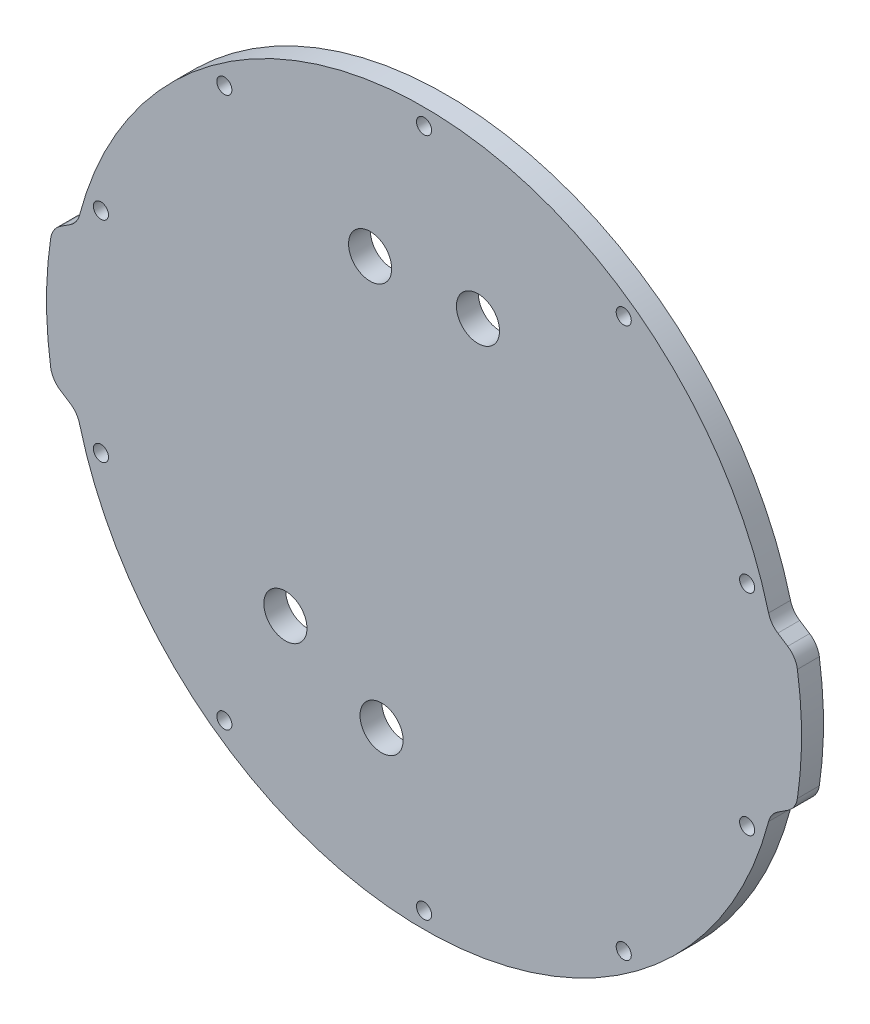
ISO-10303-21;
HEADER;
FILE_DESCRIPTION(('STEP AP214'),'2;1');
FILE_NAME('part.step','',(''),(''),'','','');
FILE_SCHEMA(('AUTOMOTIVE_DESIGN { 1 0 10303 214 1 1 1 1 }'));
ENDSEC;
DATA;
#1=APPLICATION_CONTEXT('core data for automotive mechanical design processes');
#2=APPLICATION_PROTOCOL_DEFINITION('international standard','automotive_design',2000,#1);
#3=PRODUCT_CONTEXT('',#1,'mechanical');
#4=PRODUCT('Part','Part','',(#3));
#5=PRODUCT_RELATED_PRODUCT_CATEGORY('part','',(#4));
#6=PRODUCT_DEFINITION_FORMATION('','',#4);
#7=PRODUCT_DEFINITION_CONTEXT('part definition',#1,'design');
#8=PRODUCT_DEFINITION('design','',#6,#7);
#9=PRODUCT_DEFINITION_SHAPE('','',#8);
#10=(LENGTH_UNIT() NAMED_UNIT(*) SI_UNIT(.MILLI.,.METRE.));
#11=(NAMED_UNIT(*) PLANE_ANGLE_UNIT() SI_UNIT($,.RADIAN.));
#12=(NAMED_UNIT(*) SI_UNIT($,.STERADIAN.) SOLID_ANGLE_UNIT());
#13=UNCERTAINTY_MEASURE_WITH_UNIT(LENGTH_MEASURE(1.E-05),#10,'distance_accuracy_value','');
#14=(GEOMETRIC_REPRESENTATION_CONTEXT(3) GLOBAL_UNCERTAINTY_ASSIGNED_CONTEXT((#13)) GLOBAL_UNIT_ASSIGNED_CONTEXT((#10,
#11,#12)) REPRESENTATION_CONTEXT('',''));
#15=CARTESIAN_POINT('',(0.,0.,0.));
#16=DIRECTION('',(0.,0.,1.));
#17=DIRECTION('',(1.,0.,0.));
#18=AXIS2_PLACEMENT_3D('',#15,#16,#17);
#19=CARTESIAN_POINT('',(0.,0.,2.54));
#20=DIRECTION('',(0.,0.,1.));
#21=DIRECTION('',(1.,0.,0.));
#22=AXIS2_PLACEMENT_3D('',#19,#20,#21);
#23=PLANE('',#22);
#24=CARTESIAN_POINT('',(-12.5,46.34382375247,2.54));
#25=DIRECTION('',(0.,0.,1.));
#26=DIRECTION('',(1.,0.,0.));
#27=AXIS2_PLACEMENT_3D('',#24,#25,#26);
#28=CIRCLE('',#27,5.);
#29=CARTESIAN_POINT('',(-7.5,46.34382375247,2.54));
#30=VERTEX_POINT('',#29);
#31=EDGE_CURVE('E387',#30,#30,#28,.T.);
#32=ORIENTED_EDGE('',*,*,#31,.F.);
#33=EDGE_LOOP('',(#32));
#34=FACE_BOUND('',#33,.T.);
#35=CARTESIAN_POINT('',(-46.2822107655094,63.7019981370833,2.54));
#36=DIRECTION('',(0.,0.,1.));
#37=DIRECTION('',(1.,0.,0.));
#38=AXIS2_PLACEMENT_3D('',#35,#36,#37);
#39=CIRCLE('',#38,1.75000000000102);
#40=CARTESIAN_POINT('',(-44.5322107655083,63.7019981370833,2.54));
#41=VERTEX_POINT('',#40);
#42=EDGE_CURVE('E407',#41,#41,#39,.T.);
#43=ORIENTED_EDGE('',*,*,#42,.F.);
#44=EDGE_LOOP('',(#43));
#45=FACE_BOUND('',#44,.T.);
#46=CARTESIAN_POINT('',(-74.8861900930804,-24.3319981370834,2.54));
#47=DIRECTION('',(0.,0.,1.));
#48=DIRECTION('',(1.,0.,0.));
#49=AXIS2_PLACEMENT_3D('',#46,#47,#48);
#50=CIRCLE('',#49,1.75000000000072);
#51=CARTESIAN_POINT('',(-73.1361900930797,-24.3319981370834,2.54));
#52=VERTEX_POINT('',#51);
#53=EDGE_CURVE('E443',#52,#52,#50,.T.);
#54=ORIENTED_EDGE('',*,*,#53,.F.);
#55=EDGE_LOOP('',(#54));
#56=FACE_BOUND('',#55,.T.);
#57=CARTESIAN_POINT('',(0.,-78.74,2.54));
#58=DIRECTION('',(0.,0.,1.));
#59=DIRECTION('',(1.,0.,0.));
#60=AXIS2_PLACEMENT_3D('',#57,#58,#59);
#61=CIRCLE('',#60,1.75000000000052);
#62=CARTESIAN_POINT('',(1.75000000000052,-78.74,2.54));
#63=VERTEX_POINT('',#62);
#64=EDGE_CURVE('E475',#63,#63,#61,.T.);
#65=ORIENTED_EDGE('',*,*,#64,.F.);
#66=EDGE_LOOP('',(#65));
#67=FACE_BOUND('',#66,.T.);
#68=CARTESIAN_POINT('',(74.8861900930804,-24.3319981370834,2.54));
#69=DIRECTION('',(0.,0.,1.));
#70=DIRECTION('',(1.,0.,0.));
#71=AXIS2_PLACEMENT_3D('',#68,#69,#70);
#72=CIRCLE('',#71,1.75000000000031);
#73=CARTESIAN_POINT('',(76.6361900930807,-24.3319981370834,2.54));
#74=VERTEX_POINT('',#73);
#75=EDGE_CURVE('E495',#74,#74,#72,.T.);
#76=ORIENTED_EDGE('',*,*,#75,.F.);
#77=EDGE_LOOP('',(#76));
#78=FACE_BOUND('',#77,.T.);
#79=CARTESIAN_POINT('',(46.2822107655093,63.7019981370834,2.54));
#80=DIRECTION('',(0.,0.,1.));
#81=DIRECTION('',(1.,0.,0.));
#82=AXIS2_PLACEMENT_3D('',#79,#80,#81);
#83=CIRCLE('',#82,1.75000000000012);
#84=CARTESIAN_POINT('',(48.0322107655095,63.7019981370834,2.54));
#85=VERTEX_POINT('',#84);
#86=EDGE_CURVE('E687',#85,#85,#83,.T.);
#87=ORIENTED_EDGE('',*,*,#86,.F.);
#88=EDGE_LOOP('',(#87));
#89=FACE_BOUND('',#88,.T.);
#90=CARTESIAN_POINT('',(-32.1346712353663,-35.65617624753,2.54));
#91=DIRECTION('',(0.,0.,1.));
#92=DIRECTION('',(1.,0.,0.));
#93=AXIS2_PLACEMENT_3D('',#90,#91,#92);
#94=CIRCLE('',#93,5.);
#95=CARTESIAN_POINT('',(-27.1346712353663,-35.65617624753,2.54));
#96=VERTEX_POINT('',#95);
#97=EDGE_CURVE('E226',#96,#96,#94,.T.);
#98=ORIENTED_EDGE('',*,*,#97,.F.);
#99=EDGE_LOOP('',(#98));
#100=FACE_BOUND('',#99,.T.);
#101=DIRECTION('',(-0.837556685880563,-0.54635043510257,0.));
#102=VECTOR('',#101,1.);
#103=CARTESIAN_POINT('',(-86.162592811498,15.24,2.54));
#104=LINE('',#103,#102);
#105=CARTESIAN_POINT('',(-81.9918140206452,17.9606598019133,2.54));
#106=VERTEX_POINT('',#105);
#107=CARTESIAN_POINT('',(-84.2861379976626,16.4640388277856,2.54));
#108=VERTEX_POINT('',#107);
#109=EDGE_CURVE('E239',#106,#108,#104,.T.);
#110=ORIENTED_EDGE('',*,*,#109,.T.);
#111=CARTESIAN_POINT('',(-81.5106777873416,12.2092508635123,2.54));
#112=DIRECTION('',(0.,0.,1.));
#113=DIRECTION('',(1.,0.,0.));
#114=AXIS2_PLACEMENT_3D('',#111,#112,#113);
#115=CIRCLE('',#114,5.08);
#116=CARTESIAN_POINT('',(-86.5346312350448,12.9617744547116,2.54));
#117=VERTEX_POINT('',#116);
#118=EDGE_CURVE('E422',#108,#117,#115,.T.);
#119=ORIENTED_EDGE('',*,*,#118,.T.);
#120=CARTESIAN_POINT('',(0.,0.,2.54));
#121=DIRECTION('',(0.,0.,1.));
#122=DIRECTION('',(1.,0.,0.));
#123=AXIS2_PLACEMENT_3D('',#120,#121,#122);
#124=CIRCLE('',#123,87.5);
#125=CARTESIAN_POINT('',(-86.5346312350448,-12.9617744547116,2.54));
#126=VERTEX_POINT('',#125);
#127=EDGE_CURVE('E216',#117,#126,#124,.T.);
#128=ORIENTED_EDGE('',*,*,#127,.T.);
#129=CARTESIAN_POINT('',(-81.5106777873416,-12.2092508635123,2.54));
#130=DIRECTION('',(0.,0.,1.));
#131=DIRECTION('',(1.,0.,0.));
#132=AXIS2_PLACEMENT_3D('',#129,#130,#131);
#133=CIRCLE('',#132,5.08);
#134=CARTESIAN_POINT('',(-84.2861379976626,-16.4640388277856,2.54));
#135=VERTEX_POINT('',#134);
#136=EDGE_CURVE('E426',#126,#135,#133,.T.);
#137=ORIENTED_EDGE('',*,*,#136,.T.);
#138=DIRECTION('',(0.837556685880563,-0.54635043510257,0.));
#139=VECTOR('',#138,1.);
#140=CARTESIAN_POINT('',(-86.162592811498,-15.24,2.54));
#141=LINE('',#140,#139);
#142=CARTESIAN_POINT('',(-81.9918140206452,-17.9606598019133,2.54));
#143=VERTEX_POINT('',#142);
#144=EDGE_CURVE('E287',#135,#143,#141,.T.);
#145=ORIENTED_EDGE('',*,*,#144,.T.);
#146=CARTESIAN_POINT('',(-84.7672742309663,-22.2154477661866,2.54));
#147=DIRECTION('',(0.,0.,1.));
#148=DIRECTION('',(1.,0.,0.));
#149=AXIS2_PLACEMENT_3D('',#146,#147,#148);
#150=CIRCLE('',#149,5.08);
#151=CARTESIAN_POINT('',(-79.8532293480117,-20.9275957217699,2.54));
#152=VERTEX_POINT('',#151);
#153=EDGE_CURVE('E268',#143,#152,#150,.F.);
#154=ORIENTED_EDGE('',*,*,#153,.T.);
#155=CARTESIAN_POINT('',(0.,0.,2.54));
#156=DIRECTION('',(0.,0.,1.));
#157=DIRECTION('',(1.,0.,0.));
#158=AXIS2_PLACEMENT_3D('',#155,#156,#157);
#159=CIRCLE('',#158,82.55);
#160=CARTESIAN_POINT('',(79.8532293480117,-20.9275957217699,2.54));
#161=VERTEX_POINT('',#160);
#162=EDGE_CURVE('E344',#152,#161,#159,.T.);
#163=ORIENTED_EDGE('',*,*,#162,.T.);
#164=CARTESIAN_POINT('',(84.7672742309663,-22.2154477661866,2.54));
#165=DIRECTION('',(0.,0.,1.));
#166=DIRECTION('',(1.,0.,0.));
#167=AXIS2_PLACEMENT_3D('',#164,#165,#166);
#168=CIRCLE('',#167,5.08);
#169=CARTESIAN_POINT('',(81.9918140206452,-17.9606598019133,2.54));
#170=VERTEX_POINT('',#169);
#171=EDGE_CURVE('E783',#161,#170,#168,.F.);
#172=ORIENTED_EDGE('',*,*,#171,.T.);
#173=DIRECTION('',(0.837556685880563,0.54635043510257,0.));
#174=VECTOR('',#173,1.);
#175=CARTESIAN_POINT('',(86.162592811498,-15.24,2.54));
#176=LINE('',#175,#174);
#177=CARTESIAN_POINT('',(84.2861379976626,-16.4640388277856,2.54));
#178=VERTEX_POINT('',#177);
#179=EDGE_CURVE('E340',#170,#178,#176,.T.);
#180=ORIENTED_EDGE('',*,*,#179,.T.);
#181=CARTESIAN_POINT('',(81.5106777873416,-12.2092508635123,2.54));
#182=DIRECTION('',(0.,0.,1.));
#183=DIRECTION('',(1.,0.,0.));
#184=AXIS2_PLACEMENT_3D('',#181,#182,#183);
#185=CIRCLE('',#184,5.08);
#186=CARTESIAN_POINT('',(86.5346312350448,-12.9617744547116,2.54));
#187=VERTEX_POINT('',#186);
#188=EDGE_CURVE('E319',#178,#187,#185,.T.);
#189=ORIENTED_EDGE('',*,*,#188,.T.);
#190=CARTESIAN_POINT('',(0.,0.,2.54));
#191=DIRECTION('',(0.,0.,1.));
#192=DIRECTION('',(1.,0.,0.));
#193=AXIS2_PLACEMENT_3D('',#190,#191,#192);
#194=CIRCLE('',#193,87.5);
#195=CARTESIAN_POINT('',(86.5346312350448,12.9617744547116,2.54));
#196=VERTEX_POINT('',#195);
#197=EDGE_CURVE('E336',#187,#196,#194,.T.);
#198=ORIENTED_EDGE('',*,*,#197,.T.);
#199=CARTESIAN_POINT('',(81.5106777873416,12.2092508635123,2.54));
#200=DIRECTION('',(0.,0.,1.));
#201=DIRECTION('',(1.,0.,0.));
#202=AXIS2_PLACEMENT_3D('',#199,#200,#201);
#203=CIRCLE('',#202,5.08);
#204=CARTESIAN_POINT('',(84.2861379976626,16.4640388277856,2.54));
#205=VERTEX_POINT('',#204);
#206=EDGE_CURVE('E315',#196,#205,#203,.T.);
#207=ORIENTED_EDGE('',*,*,#206,.T.);
#208=DIRECTION('',(-0.837556685880563,0.54635043510257,0.));
#209=VECTOR('',#208,1.);
#210=CARTESIAN_POINT('',(86.162592811498,15.24,2.54));
#211=LINE('',#210,#209);
#212=CARTESIAN_POINT('',(81.9918140206452,17.9606598019133,2.54));
#213=VERTEX_POINT('',#212);
#214=EDGE_CURVE('E333',#205,#213,#211,.T.);
#215=ORIENTED_EDGE('',*,*,#214,.T.);
#216=CARTESIAN_POINT('',(84.7672742309663,22.2154477661866,2.54));
#217=DIRECTION('',(0.,0.,1.));
#218=DIRECTION('',(1.,0.,0.));
#219=AXIS2_PLACEMENT_3D('',#216,#217,#218);
#220=CIRCLE('',#219,5.08);
#221=CARTESIAN_POINT('',(79.8532293480117,20.9275957217699,2.54));
#222=VERTEX_POINT('',#221);
#223=EDGE_CURVE('E12',#213,#222,#220,.F.);
#224=ORIENTED_EDGE('',*,*,#223,.T.);
#225=CARTESIAN_POINT('',(0.,0.,2.54));
#226=DIRECTION('',(0.,0.,1.));
#227=DIRECTION('',(1.,0.,0.));
#228=AXIS2_PLACEMENT_3D('',#225,#226,#227);
#229=CIRCLE('',#228,82.55);
#230=CARTESIAN_POINT('',(-79.8532293480117,20.9275957217699,2.54));
#231=VERTEX_POINT('',#230);
#232=EDGE_CURVE('E330',#222,#231,#229,.T.);
#233=ORIENTED_EDGE('',*,*,#232,.T.);
#234=CARTESIAN_POINT('',(-84.7672742309663,22.2154477661866,2.54));
#235=DIRECTION('',(0.,0.,1.));
#236=DIRECTION('',(1.,0.,0.));
#237=AXIS2_PLACEMENT_3D('',#234,#235,#236);
#238=CIRCLE('',#237,5.08);
#239=EDGE_CURVE('E258',#231,#106,#238,.F.);
#240=ORIENTED_EDGE('',*,*,#239,.T.);
#241=EDGE_LOOP('',(#110,#119,#128,#137,#145,#154,#163,#172,#180,#189,#198,#207,#215,#224,#233,#240));
#242=FACE_BOUND('',#241,.T.);
#243=CARTESIAN_POINT('',(0.,78.74,2.54));
#244=DIRECTION('',(0.,0.,1.));
#245=DIRECTION('',(1.,0.,0.));
#246=AXIS2_PLACEMENT_3D('',#243,#244,#245);
#247=CIRCLE('',#246,1.75);
#248=CARTESIAN_POINT('',(1.75,78.74,2.54));
#249=VERTEX_POINT('',#248);
#250=EDGE_CURVE('E282',#249,#249,#247,.T.);
#251=ORIENTED_EDGE('',*,*,#250,.F.);
#252=EDGE_LOOP('',(#251));
#253=FACE_BOUND('',#252,.T.);
#254=CARTESIAN_POINT('',(74.8861900930804,24.3319981370834,2.54));
#255=DIRECTION('',(0.,0.,1.));
#256=DIRECTION('',(1.,0.,0.));
#257=AXIS2_PLACEMENT_3D('',#254,#255,#256);
#258=CIRCLE('',#257,1.7500000000002);
#259=CARTESIAN_POINT('',(76.6361900930806,24.3319981370834,2.54));
#260=VERTEX_POINT('',#259);
#261=EDGE_CURVE('E497',#260,#260,#258,.T.);
#262=ORIENTED_EDGE('',*,*,#261,.F.);
#263=EDGE_LOOP('',(#262));
#264=FACE_BOUND('',#263,.T.);
#265=CARTESIAN_POINT('',(46.2822107655093,-63.7019981370834,2.54));
#266=DIRECTION('',(0.,0.,1.));
#267=DIRECTION('',(1.,0.,0.));
#268=AXIS2_PLACEMENT_3D('',#265,#266,#267);
#269=CIRCLE('',#268,1.7500000000004);
#270=CARTESIAN_POINT('',(48.0322107655098,-63.7019981370834,2.54));
#271=VERTEX_POINT('',#270);
#272=EDGE_CURVE('E477',#271,#271,#269,.T.);
#273=ORIENTED_EDGE('',*,*,#272,.F.);
#274=EDGE_LOOP('',(#273));
#275=FACE_BOUND('',#274,.T.);
#276=CARTESIAN_POINT('',(-46.2822107655094,-63.7019981370834,2.54));
#277=DIRECTION('',(0.,0.,1.));
#278=DIRECTION('',(1.,0.,0.));
#279=AXIS2_PLACEMENT_3D('',#276,#277,#278);
#280=CIRCLE('',#279,1.75000000000063);
#281=CARTESIAN_POINT('',(-44.5322107655087,-63.7019981370834,2.54));
#282=VERTEX_POINT('',#281);
#283=EDGE_CURVE('E456',#282,#282,#280,.T.);
#284=ORIENTED_EDGE('',*,*,#283,.F.);
#285=EDGE_LOOP('',(#284));
#286=FACE_BOUND('',#285,.T.);
#287=CARTESIAN_POINT('',(-74.8861900930804,24.3319981370833,2.54));
#288=DIRECTION('',(0.,0.,1.));
#289=DIRECTION('',(1.,0.,0.));
#290=AXIS2_PLACEMENT_3D('',#287,#288,#289);
#291=CIRCLE('',#290,1.75000000000087);
#292=CARTESIAN_POINT('',(-73.1361900930795,24.3319981370833,2.54));
#293=VERTEX_POINT('',#292);
#294=EDGE_CURVE('E455',#293,#293,#291,.T.);
#295=ORIENTED_EDGE('',*,*,#294,.F.);
#296=EDGE_LOOP('',(#295));
#297=FACE_BOUND('',#296,.T.);
#298=CARTESIAN_POINT('',(-9.84596747945679,-46.9793244352607,2.54));
#299=DIRECTION('',(0.,0.,1.));
#300=DIRECTION('',(1.,0.,0.));
#301=AXIS2_PLACEMENT_3D('',#298,#299,#300);
#302=CIRCLE('',#301,5.);
#303=CARTESIAN_POINT('',(-4.84596747945679,-46.9793244352607,2.54));
#304=VERTEX_POINT('',#303);
#305=EDGE_CURVE('E397',#304,#304,#302,.T.);
#306=ORIENTED_EDGE('',*,*,#305,.F.);
#307=EDGE_LOOP('',(#306));
#308=FACE_BOUND('',#307,.T.);
#309=CARTESIAN_POINT('',(12.5,46.3438237524699,2.54));
#310=DIRECTION('',(0.,0.,1.));
#311=DIRECTION('',(1.,0.,0.));
#312=AXIS2_PLACEMENT_3D('',#309,#310,#311);
#313=CIRCLE('',#312,4.99999999999997);
#314=CARTESIAN_POINT('',(17.5,46.3438237524699,2.54));
#315=VERTEX_POINT('',#314);
#316=EDGE_CURVE('E376',#315,#315,#313,.T.);
#317=ORIENTED_EDGE('',*,*,#316,.F.);
#318=EDGE_LOOP('',(#317));
#319=FACE_BOUND('',#318,.T.);
#320=ADVANCED_FACE('F48',(#34,#45,#56,#67,#78,#89,#100,#242,#253,#264,#275,#286,#297,#308,#319),
#23,.T.);
#321=CARTESIAN_POINT('',(0.,0.,-2.54));
#322=DIRECTION('',(0.,0.,1.));
#323=DIRECTION('',(1.,0.,0.));
#324=AXIS2_PLACEMENT_3D('',#321,#322,#323);
#325=PLANE('',#324);
#326=CARTESIAN_POINT('',(0.,0.,-2.54));
#327=DIRECTION('',(0.,0.,1.));
#328=DIRECTION('',(1.,0.,0.));
#329=AXIS2_PLACEMENT_3D('',#326,#327,#328);
#330=CIRCLE('',#329,87.5);
#331=CARTESIAN_POINT('',(-86.5346312350448,12.9617744547116,-2.54));
#332=VERTEX_POINT('',#331);
#333=CARTESIAN_POINT('',(-86.5346312350448,-12.9617744547116,-2.54));
#334=VERTEX_POINT('',#333);
#335=EDGE_CURVE('E213',#332,#334,#330,.T.);
#336=ORIENTED_EDGE('',*,*,#335,.F.);
#337=CARTESIAN_POINT('',(-81.5106777873416,12.2092508635123,-2.54));
#338=DIRECTION('',(0.,0.,1.));
#339=DIRECTION('',(1.,0.,0.));
#340=AXIS2_PLACEMENT_3D('',#337,#338,#339);
#341=CIRCLE('',#340,5.08);
#342=CARTESIAN_POINT('',(-84.2861379976626,16.4640388277856,-2.54));
#343=VERTEX_POINT('',#342);
#344=EDGE_CURVE('E195',#332,#343,#341,.F.);
#345=ORIENTED_EDGE('',*,*,#344,.T.);
#346=DIRECTION('',(-0.837556685880563,-0.54635043510257,0.));
#347=VECTOR('',#346,1.);
#348=CARTESIAN_POINT('',(-86.162592811498,15.24,-2.54));
#349=LINE('',#348,#347);
#350=CARTESIAN_POINT('',(-81.9918140206452,17.9606598019133,-2.54));
#351=VERTEX_POINT('',#350);
#352=EDGE_CURVE('E288',#351,#343,#349,.T.);
#353=ORIENTED_EDGE('',*,*,#352,.F.);
#354=CARTESIAN_POINT('',(-84.7672742309663,22.2154477661866,-2.54));
#355=DIRECTION('',(0.,0.,1.));
#356=DIRECTION('',(1.,0.,0.));
#357=AXIS2_PLACEMENT_3D('',#354,#355,#356);
#358=CIRCLE('',#357,5.08);
#359=CARTESIAN_POINT('',(-79.8532293480117,20.9275957217699,-2.54));
#360=VERTEX_POINT('',#359);
#361=EDGE_CURVE('E253',#351,#360,#358,.T.);
#362=ORIENTED_EDGE('',*,*,#361,.T.);
#363=CARTESIAN_POINT('',(0.,0.,-2.54));
#364=DIRECTION('',(0.,0.,1.));
#365=DIRECTION('',(1.,0.,0.));
#366=AXIS2_PLACEMENT_3D('',#363,#364,#365);
#367=CIRCLE('',#366,82.55);
#368=CARTESIAN_POINT('',(79.8532293480117,20.9275957217699,-2.54));
#369=VERTEX_POINT('',#368);
#370=EDGE_CURVE('E679',#369,#360,#367,.T.);
#371=ORIENTED_EDGE('',*,*,#370,.F.);
#372=CARTESIAN_POINT('',(84.7672742309663,22.2154477661866,-2.54));
#373=DIRECTION('',(0.,0.,1.));
#374=DIRECTION('',(1.,0.,0.));
#375=AXIS2_PLACEMENT_3D('',#372,#373,#374);
#376=CIRCLE('',#375,5.08);
#377=CARTESIAN_POINT('',(81.9918140206452,17.9606598019133,-2.54));
#378=VERTEX_POINT('',#377);
#379=EDGE_CURVE('E58',#369,#378,#376,.T.);
#380=ORIENTED_EDGE('',*,*,#379,.T.);
#381=DIRECTION('',(-0.837556685880563,0.54635043510257,0.));
#382=VECTOR('',#381,1.);
#383=CARTESIAN_POINT('',(86.162592811498,15.24,-2.54));
#384=LINE('',#383,#382);
#385=CARTESIAN_POINT('',(84.2861379976626,16.4640388277856,-2.54));
#386=VERTEX_POINT('',#385);
#387=EDGE_CURVE('E643',#386,#378,#384,.T.);
#388=ORIENTED_EDGE('',*,*,#387,.F.);
#389=CARTESIAN_POINT('',(81.5106777873416,12.2092508635123,-2.54));
#390=DIRECTION('',(0.,0.,1.));
#391=DIRECTION('',(1.,0.,0.));
#392=AXIS2_PLACEMENT_3D('',#389,#390,#391);
#393=CIRCLE('',#392,5.08);
#394=CARTESIAN_POINT('',(86.5346312350448,12.9617744547116,-2.54));
#395=VERTEX_POINT('',#394);
#396=EDGE_CURVE('E218',#386,#395,#393,.F.);
#397=ORIENTED_EDGE('',*,*,#396,.T.);
#398=CARTESIAN_POINT('',(0.,0.,-2.54));
#399=DIRECTION('',(0.,0.,1.));
#400=DIRECTION('',(1.,0.,0.));
#401=AXIS2_PLACEMENT_3D('',#398,#399,#400);
#402=CIRCLE('',#401,87.5);
#403=CARTESIAN_POINT('',(86.5346312350448,-12.9617744547116,-2.54));
#404=VERTEX_POINT('',#403);
#405=EDGE_CURVE('E666',#404,#395,#402,.T.);
#406=ORIENTED_EDGE('',*,*,#405,.F.);
#407=CARTESIAN_POINT('',(81.5106777873416,-12.2092508635123,-2.54));
#408=DIRECTION('',(0.,0.,1.));
#409=DIRECTION('',(1.,0.,0.));
#410=AXIS2_PLACEMENT_3D('',#407,#408,#409);
#411=CIRCLE('',#410,5.08);
#412=CARTESIAN_POINT('',(84.2861379976626,-16.4640388277856,-2.54));
#413=VERTEX_POINT('',#412);
#414=EDGE_CURVE('E305',#404,#413,#411,.F.);
#415=ORIENTED_EDGE('',*,*,#414,.T.);
#416=DIRECTION('',(0.837556685880563,0.54635043510257,0.));
#417=VECTOR('',#416,1.);
#418=CARTESIAN_POINT('',(86.162592811498,-15.24,-2.54));
#419=LINE('',#418,#417);
#420=CARTESIAN_POINT('',(81.9918140206452,-17.9606598019133,-2.54));
#421=VERTEX_POINT('',#420);
#422=EDGE_CURVE('E660',#421,#413,#419,.T.);
#423=ORIENTED_EDGE('',*,*,#422,.F.);
#424=CARTESIAN_POINT('',(84.7672742309663,-22.2154477661866,-2.54));
#425=DIRECTION('',(0.,0.,1.));
#426=DIRECTION('',(1.,0.,0.));
#427=AXIS2_PLACEMENT_3D('',#424,#425,#426);
#428=CIRCLE('',#427,5.08);
#429=CARTESIAN_POINT('',(79.8532293480117,-20.9275957217699,-2.54));
#430=VERTEX_POINT('',#429);
#431=EDGE_CURVE('E663',#421,#430,#428,.T.);
#432=ORIENTED_EDGE('',*,*,#431,.T.);
#433=CARTESIAN_POINT('',(0.,0.,-2.54));
#434=DIRECTION('',(0.,0.,1.));
#435=DIRECTION('',(1.,0.,0.));
#436=AXIS2_PLACEMENT_3D('',#433,#434,#435);
#437=CIRCLE('',#436,82.55);
#438=CARTESIAN_POINT('',(-79.8532293480117,-20.9275957217699,-2.54));
#439=VERTEX_POINT('',#438);
#440=EDGE_CURVE('E231',#439,#430,#437,.T.);
#441=ORIENTED_EDGE('',*,*,#440,.F.);
#442=CARTESIAN_POINT('',(-84.7672742309663,-22.2154477661866,-2.54));
#443=DIRECTION('',(0.,0.,1.));
#444=DIRECTION('',(1.,0.,0.));
#445=AXIS2_PLACEMENT_3D('',#442,#443,#444);
#446=CIRCLE('',#445,5.08);
#447=CARTESIAN_POINT('',(-81.9918140206452,-17.9606598019133,-2.54));
#448=VERTEX_POINT('',#447);
#449=EDGE_CURVE('E264',#439,#448,#446,.T.);
#450=ORIENTED_EDGE('',*,*,#449,.T.);
#451=DIRECTION('',(0.837556685880563,-0.54635043510257,0.));
#452=VECTOR('',#451,1.);
#453=CARTESIAN_POINT('',(-86.162592811498,-15.24,-2.54));
#454=LINE('',#453,#452);
#455=CARTESIAN_POINT('',(-84.2861379976626,-16.4640388277856,-2.54));
#456=VERTEX_POINT('',#455);
#457=EDGE_CURVE('E225',#456,#448,#454,.T.);
#458=ORIENTED_EDGE('',*,*,#457,.F.);
#459=CARTESIAN_POINT('',(-81.5106777873416,-12.2092508635123,-2.54));
#460=DIRECTION('',(0.,0.,1.));
#461=DIRECTION('',(1.,0.,0.));
#462=AXIS2_PLACEMENT_3D('',#459,#460,#461);
#463=CIRCLE('',#462,5.08);
#464=EDGE_CURVE('E207',#456,#334,#463,.F.);
#465=ORIENTED_EDGE('',*,*,#464,.T.);
#466=EDGE_LOOP('',(#336,#345,#353,#362,#371,#380,#388,#397,#406,#415,#423,#432,#441,#450,#458,#465));
#467=FACE_BOUND('',#466,.T.);
#468=CARTESIAN_POINT('',(-32.1346712353663,-35.65617624753,-2.54));
#469=DIRECTION('',(0.,0.,1.));
#470=DIRECTION('',(1.,0.,0.));
#471=AXIS2_PLACEMENT_3D('',#468,#469,#470);
#472=CIRCLE('',#471,5.);
#473=CARTESIAN_POINT('',(-27.1346712353663,-35.65617624753,-2.54));
#474=VERTEX_POINT('',#473);
#475=EDGE_CURVE('E235',#474,#474,#472,.T.);
#476=ORIENTED_EDGE('',*,*,#475,.T.);
#477=EDGE_LOOP('',(#476));
#478=FACE_BOUND('',#477,.T.);
#479=CARTESIAN_POINT('',(0.,78.74,-2.54));
#480=DIRECTION('',(0.,0.,1.));
#481=DIRECTION('',(1.,0.,0.));
#482=AXIS2_PLACEMENT_3D('',#479,#480,#481);
#483=CIRCLE('',#482,1.75);
#484=CARTESIAN_POINT('',(1.75,78.74,-2.54));
#485=VERTEX_POINT('',#484);
#486=EDGE_CURVE('E691',#485,#485,#483,.T.);
#487=ORIENTED_EDGE('',*,*,#486,.T.);
#488=EDGE_LOOP('',(#487));
#489=FACE_BOUND('',#488,.T.);
#490=CARTESIAN_POINT('',(46.2822107655093,63.7019981370834,-2.54));
#491=DIRECTION('',(0.,0.,1.));
#492=DIRECTION('',(1.,0.,0.));
#493=AXIS2_PLACEMENT_3D('',#490,#491,#492);
#494=CIRCLE('',#493,1.75000000000012);
#495=CARTESIAN_POINT('',(48.0322107655095,63.7019981370834,-2.54));
#496=VERTEX_POINT('',#495);
#497=EDGE_CURVE('E502',#496,#496,#494,.T.);
#498=ORIENTED_EDGE('',*,*,#497,.T.);
#499=EDGE_LOOP('',(#498));
#500=FACE_BOUND('',#499,.T.);
#501=CARTESIAN_POINT('',(74.8861900930804,24.3319981370834,-2.54));
#502=DIRECTION('',(0.,0.,1.));
#503=DIRECTION('',(1.,0.,0.));
#504=AXIS2_PLACEMENT_3D('',#501,#502,#503);
#505=CIRCLE('',#504,1.7500000000002);
#506=CARTESIAN_POINT('',(76.6361900930806,24.3319981370834,-2.54));
#507=VERTEX_POINT('',#506);
#508=EDGE_CURVE('E503',#507,#507,#505,.T.);
#509=ORIENTED_EDGE('',*,*,#508,.T.);
#510=EDGE_LOOP('',(#509));
#511=FACE_BOUND('',#510,.T.);
#512=CARTESIAN_POINT('',(74.8861900930804,-24.3319981370834,-2.54));
#513=DIRECTION('',(0.,0.,1.));
#514=DIRECTION('',(1.,0.,0.));
#515=AXIS2_PLACEMENT_3D('',#512,#513,#514);
#516=CIRCLE('',#515,1.75000000000031);
#517=CARTESIAN_POINT('',(76.6361900930807,-24.3319981370834,-2.54));
#518=VERTEX_POINT('',#517);
#519=EDGE_CURVE('E482',#518,#518,#516,.T.);
#520=ORIENTED_EDGE('',*,*,#519,.T.);
#521=EDGE_LOOP('',(#520));
#522=FACE_BOUND('',#521,.T.);
#523=CARTESIAN_POINT('',(46.2822107655093,-63.7019981370834,-2.54));
#524=DIRECTION('',(0.,0.,1.));
#525=DIRECTION('',(1.,0.,0.));
#526=AXIS2_PLACEMENT_3D('',#523,#524,#525);
#527=CIRCLE('',#526,1.7500000000004);
#528=CARTESIAN_POINT('',(48.0322107655098,-63.7019981370834,-2.54));
#529=VERTEX_POINT('',#528);
#530=EDGE_CURVE('E483',#529,#529,#527,.T.);
#531=ORIENTED_EDGE('',*,*,#530,.T.);
#532=EDGE_LOOP('',(#531));
#533=FACE_BOUND('',#532,.T.);
#534=CARTESIAN_POINT('',(0.,-78.74,-2.54));
#535=DIRECTION('',(0.,0.,1.));
#536=DIRECTION('',(1.,0.,0.));
#537=AXIS2_PLACEMENT_3D('',#534,#535,#536);
#538=CIRCLE('',#537,1.75000000000052);
#539=CARTESIAN_POINT('',(1.75000000000052,-78.74,-2.54));
#540=VERTEX_POINT('',#539);
#541=EDGE_CURVE('E461',#540,#540,#538,.T.);
#542=ORIENTED_EDGE('',*,*,#541,.T.);
#543=EDGE_LOOP('',(#542));
#544=FACE_BOUND('',#543,.T.);
#545=CARTESIAN_POINT('',(-46.2822107655094,-63.7019981370834,-2.54));
#546=DIRECTION('',(0.,0.,1.));
#547=DIRECTION('',(1.,0.,0.));
#548=AXIS2_PLACEMENT_3D('',#545,#546,#547);
#549=CIRCLE('',#548,1.75000000000063);
#550=CARTESIAN_POINT('',(-44.5322107655087,-63.7019981370834,-2.54));
#551=VERTEX_POINT('',#550);
#552=EDGE_CURVE('E448',#551,#551,#549,.T.);
#553=ORIENTED_EDGE('',*,*,#552,.T.);
#554=EDGE_LOOP('',(#553));
#555=FACE_BOUND('',#554,.T.);
#556=CARTESIAN_POINT('',(-74.8861900930804,-24.3319981370834,-2.54));
#557=DIRECTION('',(0.,0.,1.));
#558=DIRECTION('',(1.,0.,0.));
#559=AXIS2_PLACEMENT_3D('',#556,#557,#558);
#560=CIRCLE('',#559,1.75000000000072);
#561=CARTESIAN_POINT('',(-73.1361900930797,-24.3319981370834,-2.54));
#562=VERTEX_POINT('',#561);
#563=EDGE_CURVE('E449',#562,#562,#560,.T.);
#564=ORIENTED_EDGE('',*,*,#563,.T.);
#565=EDGE_LOOP('',(#564));
#566=FACE_BOUND('',#565,.T.);
#567=CARTESIAN_POINT('',(-74.8861900930804,24.3319981370833,-2.54));
#568=DIRECTION('',(0.,0.,1.));
#569=DIRECTION('',(1.,0.,0.));
#570=AXIS2_PLACEMENT_3D('',#567,#568,#569);
#571=CIRCLE('',#570,1.75000000000087);
#572=CARTESIAN_POINT('',(-73.1361900930795,24.3319981370833,-2.54));
#573=VERTEX_POINT('',#572);
#574=EDGE_CURVE('E412',#573,#573,#571,.T.);
#575=ORIENTED_EDGE('',*,*,#574,.T.);
#576=EDGE_LOOP('',(#575));
#577=FACE_BOUND('',#576,.T.);
#578=CARTESIAN_POINT('',(-46.2822107655094,63.7019981370833,-2.54));
#579=DIRECTION('',(0.,0.,1.));
#580=DIRECTION('',(1.,0.,0.));
#581=AXIS2_PLACEMENT_3D('',#578,#579,#580);
#582=CIRCLE('',#581,1.75000000000102);
#583=CARTESIAN_POINT('',(-44.5322107655083,63.7019981370833,-2.54));
#584=VERTEX_POINT('',#583);
#585=EDGE_CURVE('E401',#584,#584,#582,.T.);
#586=ORIENTED_EDGE('',*,*,#585,.T.);
#587=EDGE_LOOP('',(#586));
#588=FACE_BOUND('',#587,.T.);
#589=CARTESIAN_POINT('',(-9.84596747945679,-46.9793244352607,-2.54));
#590=DIRECTION('',(0.,0.,1.));
#591=DIRECTION('',(1.,0.,0.));
#592=AXIS2_PLACEMENT_3D('',#589,#590,#591);
#593=CIRCLE('',#592,5.);
#594=CARTESIAN_POINT('',(-4.84596747945679,-46.9793244352607,-2.54));
#595=VERTEX_POINT('',#594);
#596=EDGE_CURVE('E402',#595,#595,#593,.T.);
#597=ORIENTED_EDGE('',*,*,#596,.T.);
#598=EDGE_LOOP('',(#597));
#599=FACE_BOUND('',#598,.T.);
#600=CARTESIAN_POINT('',(-12.5,46.34382375247,-2.54));
#601=DIRECTION('',(0.,0.,1.));
#602=DIRECTION('',(1.,0.,0.));
#603=AXIS2_PLACEMENT_3D('',#600,#601,#602);
#604=CIRCLE('',#603,5.);
#605=CARTESIAN_POINT('',(-7.5,46.34382375247,-2.54));
#606=VERTEX_POINT('',#605);
#607=EDGE_CURVE('E381',#606,#606,#604,.T.);
#608=ORIENTED_EDGE('',*,*,#607,.T.);
#609=EDGE_LOOP('',(#608));
#610=FACE_BOUND('',#609,.T.);
#611=CARTESIAN_POINT('',(12.5,46.3438237524699,-2.54));
#612=DIRECTION('',(0.,0.,1.));
#613=DIRECTION('',(1.,0.,0.));
#614=AXIS2_PLACEMENT_3D('',#611,#612,#613);
#615=CIRCLE('',#614,4.99999999999997);
#616=CARTESIAN_POINT('',(17.5,46.3438237524699,-2.54));
#617=VERTEX_POINT('',#616);
#618=EDGE_CURVE('E382',#617,#617,#615,.T.);
#619=ORIENTED_EDGE('',*,*,#618,.T.);
#620=EDGE_LOOP('',(#619));
#621=FACE_BOUND('',#620,.T.);
#622=ADVANCED_FACE('F221',(#467,#478,#489,#500,#511,#522,#533,#544,#555,#566,#577,#588,#599,
#610,#621),#325,.F.);
#623=CARTESIAN_POINT('',(0.,0.,2.54));
#624=DIRECTION('',(0.,0.,-1.));
#625=DIRECTION('',(-1.,0.,0.));
#626=AXIS2_PLACEMENT_3D('',#623,#624,#625);
#627=CYLINDRICAL_SURFACE('',#626,87.5);
#628=ORIENTED_EDGE('',*,*,#127,.F.);
#629=DIRECTION('',(0.,0.,-1.));
#630=VECTOR('',#629,1.);
#631=CARTESIAN_POINT('',(-86.5346312350448,12.9617744547116,2.54));
#632=LINE('',#631,#630);
#633=EDGE_CURVE('E199',#117,#332,#632,.T.);
#634=ORIENTED_EDGE('',*,*,#633,.T.);
#635=ORIENTED_EDGE('',*,*,#335,.T.);
#636=DIRECTION('',(0.,0.,-1.));
#637=VECTOR('',#636,1.);
#638=CARTESIAN_POINT('',(-86.5346312350448,-12.9617744547116,2.54));
#639=LINE('',#638,#637);
#640=EDGE_CURVE('E219',#334,#126,#639,.F.);
#641=ORIENTED_EDGE('',*,*,#640,.T.);
#642=EDGE_LOOP('',(#628,#634,#635,#641));
#643=FACE_BOUND('',#642,.T.);
#644=ADVANCED_FACE('F212',(#643),#627,.T.);
#645=CARTESIAN_POINT('',(-86.162592811498,-15.24,2.54));
#646=DIRECTION('',(0.54635043510257,0.837556685880563,0.));
#647=DIRECTION('',(-0.837556685880564,0.54635043510257,0.));
#648=AXIS2_PLACEMENT_3D('',#645,#646,#647);
#649=PLANE('',#648);
#650=ORIENTED_EDGE('',*,*,#144,.F.);
#651=DIRECTION('',(0.,0.,-1.));
#652=VECTOR('',#651,1.);
#653=CARTESIAN_POINT('',(-84.2861379976626,-16.4640388277856,2.54));
#654=LINE('',#653,#652);
#655=EDGE_CURVE('E437',#135,#456,#654,.T.);
#656=ORIENTED_EDGE('',*,*,#655,.T.);
#657=ORIENTED_EDGE('',*,*,#457,.T.);
#658=DIRECTION('',(0.,0.,1.));
#659=VECTOR('',#658,1.);
#660=CARTESIAN_POINT('',(-81.9918140206452,-17.9606598019133,2.54));
#661=LINE('',#660,#659);
#662=EDGE_CURVE('E434',#448,#143,#661,.T.);
#663=ORIENTED_EDGE('',*,*,#662,.T.);
#664=EDGE_LOOP('',(#650,#656,#657,#663));
#665=FACE_BOUND('',#664,.T.);
#666=ADVANCED_FACE('F582',(#665),#649,.F.);
#667=CARTESIAN_POINT('',(0.,0.,2.54));
#668=DIRECTION('',(0.,0.,-1.));
#669=DIRECTION('',(-1.,0.,0.));
#670=AXIS2_PLACEMENT_3D('',#667,#668,#669);
#671=CYLINDRICAL_SURFACE('',#670,82.55);
#672=ORIENTED_EDGE('',*,*,#162,.F.);
#673=DIRECTION('',(0.,0.,-1.));
#674=VECTOR('',#673,1.);
#675=CARTESIAN_POINT('',(-79.8532293480117,-20.92759572177,2.54));
#676=LINE('',#675,#674);
#677=EDGE_CURVE('E353',#152,#439,#676,.T.);
#678=ORIENTED_EDGE('',*,*,#677,.T.);
#679=ORIENTED_EDGE('',*,*,#440,.T.);
#680=DIRECTION('',(0.,0.,-1.));
#681=VECTOR('',#680,1.);
#682=CARTESIAN_POINT('',(79.8532293480117,-20.92759572177,2.54));
#683=LINE('',#682,#681);
#684=EDGE_CURVE('E360',#430,#161,#683,.F.);
#685=ORIENTED_EDGE('',*,*,#684,.T.);
#686=EDGE_LOOP('',(#672,#678,#679,#685));
#687=FACE_BOUND('',#686,.T.);
#688=ADVANCED_FACE('F578',(#687),#671,.T.);
#689=CARTESIAN_POINT('',(86.162592811498,-15.24,2.54));
#690=DIRECTION('',(-0.54635043510257,0.837556685880563,0.));
#691=DIRECTION('',(-0.837556685880564,-0.54635043510257,0.));
#692=AXIS2_PLACEMENT_3D('',#689,#690,#691);
#693=PLANE('',#692);
#694=ORIENTED_EDGE('',*,*,#422,.T.);
#695=DIRECTION('',(0.,0.,-1.));
#696=VECTOR('',#695,1.);
#697=CARTESIAN_POINT('',(84.2861379976626,-16.4640388277856,2.54));
#698=LINE('',#697,#696);
#699=EDGE_CURVE('E645',#413,#178,#698,.F.);
#700=ORIENTED_EDGE('',*,*,#699,.T.);
#701=ORIENTED_EDGE('',*,*,#179,.F.);
#702=DIRECTION('',(0.,0.,1.));
#703=VECTOR('',#702,1.);
#704=CARTESIAN_POINT('',(81.9918140206452,-17.9606598019133,-2.54));
#705=LINE('',#704,#703);
#706=EDGE_CURVE('E369',#170,#421,#705,.F.);
#707=ORIENTED_EDGE('',*,*,#706,.T.);
#708=EDGE_LOOP('',(#694,#700,#701,#707));
#709=FACE_BOUND('',#708,.T.);
#710=ADVANCED_FACE('F574',(#709),#693,.F.);
#711=CARTESIAN_POINT('',(0.,0.,2.54));
#712=DIRECTION('',(0.,0.,-1.));
#713=DIRECTION('',(-1.,0.,0.));
#714=AXIS2_PLACEMENT_3D('',#711,#712,#713);
#715=CYLINDRICAL_SURFACE('',#714,87.5);
#716=ORIENTED_EDGE('',*,*,#197,.F.);
#717=DIRECTION('',(0.,0.,-1.));
#718=VECTOR('',#717,1.);
#719=CARTESIAN_POINT('',(86.5346312350448,-12.9617744547116,2.54));
#720=LINE('',#719,#718);
#721=EDGE_CURVE('E364',#187,#404,#720,.T.);
#722=ORIENTED_EDGE('',*,*,#721,.T.);
#723=ORIENTED_EDGE('',*,*,#405,.T.);
#724=DIRECTION('',(0.,0.,-1.));
#725=VECTOR('',#724,1.);
#726=CARTESIAN_POINT('',(86.5346312350448,12.9617744547116,2.54));
#727=LINE('',#726,#725);
#728=EDGE_CURVE('E359',#395,#196,#727,.F.);
#729=ORIENTED_EDGE('',*,*,#728,.T.);
#730=EDGE_LOOP('',(#716,#722,#723,#729));
#731=FACE_BOUND('',#730,.T.);
#732=ADVANCED_FACE('F570',(#731),#715,.T.);
#733=CARTESIAN_POINT('',(86.162592811498,15.24,2.54));
#734=DIRECTION('',(-0.54635043510257,-0.837556685880563,0.));
#735=DIRECTION('',(0.837556685880564,-0.54635043510257,0.));
#736=AXIS2_PLACEMENT_3D('',#733,#734,#735);
#737=PLANE('',#736);
#738=ORIENTED_EDGE('',*,*,#214,.F.);
#739=DIRECTION('',(0.,0.,-1.));
#740=VECTOR('',#739,1.);
#741=CARTESIAN_POINT('',(84.2861379976626,16.4640388277856,2.54));
#742=LINE('',#741,#740);
#743=EDGE_CURVE('E259',#205,#386,#742,.T.);
#744=ORIENTED_EDGE('',*,*,#743,.T.);
#745=ORIENTED_EDGE('',*,*,#387,.T.);
#746=DIRECTION('',(0.,0.,1.));
#747=VECTOR('',#746,1.);
#748=CARTESIAN_POINT('',(81.9918140206452,17.9606598019133,2.54));
#749=LINE('',#748,#747);
#750=EDGE_CURVE('E642',#378,#213,#749,.T.);
#751=ORIENTED_EDGE('',*,*,#750,.T.);
#752=EDGE_LOOP('',(#738,#744,#745,#751));
#753=FACE_BOUND('',#752,.T.);
#754=ADVANCED_FACE('F566',(#753),#737,.F.);
#755=CARTESIAN_POINT('',(0.,0.,2.54));
#756=DIRECTION('',(0.,0.,-1.));
#757=DIRECTION('',(-1.,0.,0.));
#758=AXIS2_PLACEMENT_3D('',#755,#756,#757);
#759=CYLINDRICAL_SURFACE('',#758,82.55);
#760=ORIENTED_EDGE('',*,*,#370,.T.);
#761=DIRECTION('',(0.,0.,-1.));
#762=VECTOR('',#761,1.);
#763=CARTESIAN_POINT('',(-79.8532293480117,20.92759572177,2.54));
#764=LINE('',#763,#762);
#765=EDGE_CURVE('E67',#360,#231,#764,.F.);
#766=ORIENTED_EDGE('',*,*,#765,.T.);
#767=ORIENTED_EDGE('',*,*,#232,.F.);
#768=DIRECTION('',(0.,0.,-1.));
#769=VECTOR('',#768,1.);
#770=CARTESIAN_POINT('',(79.8532293480117,20.92759572177,2.54));
#771=LINE('',#770,#769);
#772=EDGE_CURVE('E425',#222,#369,#771,.T.);
#773=ORIENTED_EDGE('',*,*,#772,.T.);
#774=EDGE_LOOP('',(#760,#766,#767,#773));
#775=FACE_BOUND('',#774,.T.);
#776=ADVANCED_FACE('F560',(#775),#759,.T.);
#777=CARTESIAN_POINT('',(-86.162592811498,15.24,2.54));
#778=DIRECTION('',(0.54635043510257,-0.837556685880563,0.));
#779=DIRECTION('',(0.837556685880564,0.54635043510257,0.));
#780=AXIS2_PLACEMENT_3D('',#777,#778,#779);
#781=PLANE('',#780);
#782=ORIENTED_EDGE('',*,*,#352,.T.);
#783=DIRECTION('',(0.,0.,-1.));
#784=VECTOR('',#783,1.);
#785=CARTESIAN_POINT('',(-84.2861379976626,16.4640388277856,2.54));
#786=LINE('',#785,#784);
#787=EDGE_CURVE('E200',#343,#108,#786,.F.);
#788=ORIENTED_EDGE('',*,*,#787,.T.);
#789=ORIENTED_EDGE('',*,*,#109,.F.);
#790=DIRECTION('',(0.,0.,1.));
#791=VECTOR('',#790,1.);
#792=CARTESIAN_POINT('',(-81.9918140206452,17.9606598019133,-2.54));
#793=LINE('',#792,#791);
#794=EDGE_CURVE('E206',#106,#351,#793,.F.);
#795=ORIENTED_EDGE('',*,*,#794,.T.);
#796=EDGE_LOOP('',(#782,#788,#789,#795));
#797=FACE_BOUND('',#796,.T.);
#798=ADVANCED_FACE('F555',(#797),#781,.F.);
#799=CARTESIAN_POINT('',(-32.1346712353663,-35.65617624753,2.54));
#800=DIRECTION('',(0.,0.,-1.));
#801=DIRECTION('',(-1.,0.,0.));
#802=AXIS2_PLACEMENT_3D('',#799,#800,#801);
#803=CYLINDRICAL_SURFACE('',#802,5.);
#804=ORIENTED_EDGE('',*,*,#97,.T.);
#805=EDGE_LOOP('',(#804));
#806=FACE_BOUND('',#805,.T.);
#807=ORIENTED_EDGE('',*,*,#475,.F.);
#808=EDGE_LOOP('',(#807));
#809=FACE_BOUND('',#808,.T.);
#810=ADVANCED_FACE('F548',(#806,#809),#803,.F.);
#811=CARTESIAN_POINT('',(0.,78.74,2.54));
#812=DIRECTION('',(0.,0.,-1.));
#813=DIRECTION('',(-1.,0.,0.));
#814=AXIS2_PLACEMENT_3D('',#811,#812,#813);
#815=CYLINDRICAL_SURFACE('',#814,1.75);
#816=ORIENTED_EDGE('',*,*,#250,.T.);
#817=EDGE_LOOP('',(#816));
#818=FACE_BOUND('',#817,.T.);
#819=ORIENTED_EDGE('',*,*,#486,.F.);
#820=EDGE_LOOP('',(#819));
#821=FACE_BOUND('',#820,.T.);
#822=ADVANCED_FACE('F706',(#818,#821),#815,.F.);
#823=CARTESIAN_POINT('',(46.2822107655093,63.7019981370834,2.54));
#824=DIRECTION('',(0.,0.,-1.));
#825=DIRECTION('',(-1.,0.,0.));
#826=AXIS2_PLACEMENT_3D('',#823,#824,#825);
#827=CYLINDRICAL_SURFACE('',#826,1.75000000000012);
#828=ORIENTED_EDGE('',*,*,#86,.T.);
#829=EDGE_LOOP('',(#828));
#830=FACE_BOUND('',#829,.T.);
#831=ORIENTED_EDGE('',*,*,#497,.F.);
#832=EDGE_LOOP('',(#831));
#833=FACE_BOUND('',#832,.T.);
#834=ADVANCED_FACE('F708',(#830,#833),#827,.F.);
#835=CARTESIAN_POINT('',(74.8861900930804,24.3319981370834,2.54));
#836=DIRECTION('',(0.,0.,-1.));
#837=DIRECTION('',(-1.,0.,0.));
#838=AXIS2_PLACEMENT_3D('',#835,#836,#837);
#839=CYLINDRICAL_SURFACE('',#838,1.7500000000002);
#840=ORIENTED_EDGE('',*,*,#261,.T.);
#841=EDGE_LOOP('',(#840));
#842=FACE_BOUND('',#841,.T.);
#843=ORIENTED_EDGE('',*,*,#508,.F.);
#844=EDGE_LOOP('',(#843));
#845=FACE_BOUND('',#844,.T.);
#846=ADVANCED_FACE('F714',(#842,#845),#839,.F.);
#847=CARTESIAN_POINT('',(74.8861900930804,-24.3319981370834,2.54));
#848=DIRECTION('',(0.,0.,-1.));
#849=DIRECTION('',(-1.,0.,0.));
#850=AXIS2_PLACEMENT_3D('',#847,#848,#849);
#851=CYLINDRICAL_SURFACE('',#850,1.75000000000031);
#852=ORIENTED_EDGE('',*,*,#75,.T.);
#853=EDGE_LOOP('',(#852));
#854=FACE_BOUND('',#853,.T.);
#855=ORIENTED_EDGE('',*,*,#519,.F.);
#856=EDGE_LOOP('',(#855));
#857=FACE_BOUND('',#856,.T.);
#858=ADVANCED_FACE('F723',(#854,#857),#851,.F.);
#859=CARTESIAN_POINT('',(46.2822107655093,-63.7019981370834,2.54));
#860=DIRECTION('',(0.,0.,-1.));
#861=DIRECTION('',(-1.,0.,0.));
#862=AXIS2_PLACEMENT_3D('',#859,#860,#861);
#863=CYLINDRICAL_SURFACE('',#862,1.7500000000004);
#864=ORIENTED_EDGE('',*,*,#272,.T.);
#865=EDGE_LOOP('',(#864));
#866=FACE_BOUND('',#865,.T.);
#867=ORIENTED_EDGE('',*,*,#530,.F.);
#868=EDGE_LOOP('',(#867));
#869=FACE_BOUND('',#868,.T.);
#870=ADVANCED_FACE('F728',(#866,#869),#863,.F.);
#871=CARTESIAN_POINT('',(0.,-78.74,2.54));
#872=DIRECTION('',(0.,0.,-1.));
#873=DIRECTION('',(-1.,0.,0.));
#874=AXIS2_PLACEMENT_3D('',#871,#872,#873);
#875=CYLINDRICAL_SURFACE('',#874,1.75000000000052);
#876=ORIENTED_EDGE('',*,*,#64,.T.);
#877=EDGE_LOOP('',(#876));
#878=FACE_BOUND('',#877,.T.);
#879=ORIENTED_EDGE('',*,*,#541,.F.);
#880=EDGE_LOOP('',(#879));
#881=FACE_BOUND('',#880,.T.);
#882=ADVANCED_FACE('F733',(#878,#881),#875,.F.);
#883=CARTESIAN_POINT('',(-46.2822107655094,-63.7019981370834,2.54));
#884=DIRECTION('',(0.,0.,-1.));
#885=DIRECTION('',(-1.,0.,0.));
#886=AXIS2_PLACEMENT_3D('',#883,#884,#885);
#887=CYLINDRICAL_SURFACE('',#886,1.75000000000063);
#888=ORIENTED_EDGE('',*,*,#283,.T.);
#889=EDGE_LOOP('',(#888));
#890=FACE_BOUND('',#889,.T.);
#891=ORIENTED_EDGE('',*,*,#552,.F.);
#892=EDGE_LOOP('',(#891));
#893=FACE_BOUND('',#892,.T.);
#894=ADVANCED_FACE('F530',(#890,#893),#887,.F.);
#895=CARTESIAN_POINT('',(-74.8861900930804,-24.3319981370834,2.54));
#896=DIRECTION('',(0.,0.,-1.));
#897=DIRECTION('',(-1.,0.,0.));
#898=AXIS2_PLACEMENT_3D('',#895,#896,#897);
#899=CYLINDRICAL_SURFACE('',#898,1.75000000000072);
#900=ORIENTED_EDGE('',*,*,#53,.T.);
#901=EDGE_LOOP('',(#900));
#902=FACE_BOUND('',#901,.T.);
#903=ORIENTED_EDGE('',*,*,#563,.F.);
#904=EDGE_LOOP('',(#903));
#905=FACE_BOUND('',#904,.T.);
#906=ADVANCED_FACE('F521',(#902,#905),#899,.F.);
#907=CARTESIAN_POINT('',(-74.8861900930804,24.3319981370833,2.54));
#908=DIRECTION('',(0.,0.,-1.));
#909=DIRECTION('',(-1.,0.,0.));
#910=AXIS2_PLACEMENT_3D('',#907,#908,#909);
#911=CYLINDRICAL_SURFACE('',#910,1.75000000000087);
#912=ORIENTED_EDGE('',*,*,#294,.T.);
#913=EDGE_LOOP('',(#912));
#914=FACE_BOUND('',#913,.T.);
#915=ORIENTED_EDGE('',*,*,#574,.F.);
#916=EDGE_LOOP('',(#915));
#917=FACE_BOUND('',#916,.T.);
#918=ADVANCED_FACE('F518',(#914,#917),#911,.F.);
#919=CARTESIAN_POINT('',(-46.2822107655094,63.7019981370833,2.54));
#920=DIRECTION('',(0.,0.,-1.));
#921=DIRECTION('',(-1.,0.,0.));
#922=AXIS2_PLACEMENT_3D('',#919,#920,#921);
#923=CYLINDRICAL_SURFACE('',#922,1.75000000000102);
#924=ORIENTED_EDGE('',*,*,#42,.T.);
#925=EDGE_LOOP('',(#924));
#926=FACE_BOUND('',#925,.T.);
#927=ORIENTED_EDGE('',*,*,#585,.F.);
#928=EDGE_LOOP('',(#927));
#929=FACE_BOUND('',#928,.T.);
#930=ADVANCED_FACE('F520',(#926,#929),#923,.F.);
#931=CARTESIAN_POINT('',(-9.84596747945679,-46.9793244352607,2.54));
#932=DIRECTION('',(0.,0.,-1.));
#933=DIRECTION('',(-1.,0.,0.));
#934=AXIS2_PLACEMENT_3D('',#931,#932,#933);
#935=CYLINDRICAL_SURFACE('',#934,5.);
#936=ORIENTED_EDGE('',*,*,#305,.T.);
#937=EDGE_LOOP('',(#936));
#938=FACE_BOUND('',#937,.T.);
#939=ORIENTED_EDGE('',*,*,#596,.F.);
#940=EDGE_LOOP('',(#939));
#941=FACE_BOUND('',#940,.T.);
#942=ADVANCED_FACE('F527',(#938,#941),#935,.F.);
#943=CARTESIAN_POINT('',(-12.5,46.34382375247,2.54));
#944=DIRECTION('',(0.,0.,-1.));
#945=DIRECTION('',(-1.,0.,0.));
#946=AXIS2_PLACEMENT_3D('',#943,#944,#945);
#947=CYLINDRICAL_SURFACE('',#946,5.);
#948=ORIENTED_EDGE('',*,*,#31,.T.);
#949=EDGE_LOOP('',(#948));
#950=FACE_BOUND('',#949,.T.);
#951=ORIENTED_EDGE('',*,*,#607,.F.);
#952=EDGE_LOOP('',(#951));
#953=FACE_BOUND('',#952,.T.);
#954=ADVANCED_FACE('F810',(#950,#953),#947,.F.);
#955=CARTESIAN_POINT('',(12.5,46.3438237524699,2.54));
#956=DIRECTION('',(0.,0.,-1.));
#957=DIRECTION('',(-1.,0.,0.));
#958=AXIS2_PLACEMENT_3D('',#955,#956,#957);
#959=CYLINDRICAL_SURFACE('',#958,4.99999999999997);
#960=ORIENTED_EDGE('',*,*,#316,.T.);
#961=EDGE_LOOP('',(#960));
#962=FACE_BOUND('',#961,.T.);
#963=ORIENTED_EDGE('',*,*,#618,.F.);
#964=EDGE_LOOP('',(#963));
#965=FACE_BOUND('',#964,.T.);
#966=ADVANCED_FACE('F597',(#962,#965),#959,.F.);
#967=CARTESIAN_POINT('',(-81.5106777873416,12.2092508635123,2.54));
#968=DIRECTION('',(0.,0.,-1.));
#969=DIRECTION('',(-1.,0.,0.));
#970=AXIS2_PLACEMENT_3D('',#967,#968,#969);
#971=CYLINDRICAL_SURFACE('',#970,5.08);
#972=ORIENTED_EDGE('',*,*,#118,.F.);
#973=ORIENTED_EDGE('',*,*,#787,.F.);
#974=ORIENTED_EDGE('',*,*,#344,.F.);
#975=ORIENTED_EDGE('',*,*,#633,.F.);
#976=EDGE_LOOP('',(#972,#973,#974,#975));
#977=FACE_BOUND('',#976,.T.);
#978=ADVANCED_FACE('F198',(#977),#971,.T.);
#979=CARTESIAN_POINT('',(-84.7672742309663,22.2154477661866,2.54));
#980=DIRECTION('',(0.,0.,-1.));
#981=DIRECTION('',(-1.,0.,0.));
#982=AXIS2_PLACEMENT_3D('',#979,#980,#981);
#983=CYLINDRICAL_SURFACE('',#982,5.08);
#984=ORIENTED_EDGE('',*,*,#239,.F.);
#985=ORIENTED_EDGE('',*,*,#765,.F.);
#986=ORIENTED_EDGE('',*,*,#361,.F.);
#987=ORIENTED_EDGE('',*,*,#794,.F.);
#988=EDGE_LOOP('',(#984,#985,#986,#987));
#989=FACE_BOUND('',#988,.T.);
#990=ADVANCED_FACE('F596',(#989),#983,.F.);
#991=CARTESIAN_POINT('',(-81.5106777873416,-12.2092508635123,2.54));
#992=DIRECTION('',(0.,0.,-1.));
#993=DIRECTION('',(-1.,0.,0.));
#994=AXIS2_PLACEMENT_3D('',#991,#992,#993);
#995=CYLINDRICAL_SURFACE('',#994,5.08);
#996=ORIENTED_EDGE('',*,*,#136,.F.);
#997=ORIENTED_EDGE('',*,*,#640,.F.);
#998=ORIENTED_EDGE('',*,*,#464,.F.);
#999=ORIENTED_EDGE('',*,*,#655,.F.);
#1000=EDGE_LOOP('',(#996,#997,#998,#999));
#1001=FACE_BOUND('',#1000,.T.);
#1002=ADVANCED_FACE('F603',(#1001),#995,.T.);
#1003=CARTESIAN_POINT('',(-84.7672742309663,-22.2154477661866,2.54));
#1004=DIRECTION('',(0.,0.,-1.));
#1005=DIRECTION('',(-1.,0.,0.));
#1006=AXIS2_PLACEMENT_3D('',#1003,#1004,#1005);
#1007=CYLINDRICAL_SURFACE('',#1006,5.08);
#1008=ORIENTED_EDGE('',*,*,#153,.F.);
#1009=ORIENTED_EDGE('',*,*,#662,.F.);
#1010=ORIENTED_EDGE('',*,*,#449,.F.);
#1011=ORIENTED_EDGE('',*,*,#677,.F.);
#1012=EDGE_LOOP('',(#1008,#1009,#1010,#1011));
#1013=FACE_BOUND('',#1012,.T.);
#1014=ADVANCED_FACE('F607',(#1013),#1007,.F.);
#1015=CARTESIAN_POINT('',(81.5106777873416,-12.2092508635123,2.54));
#1016=DIRECTION('',(0.,0.,-1.));
#1017=DIRECTION('',(-1.,0.,0.));
#1018=AXIS2_PLACEMENT_3D('',#1015,#1016,#1017);
#1019=CYLINDRICAL_SURFACE('',#1018,5.08);
#1020=ORIENTED_EDGE('',*,*,#188,.F.);
#1021=ORIENTED_EDGE('',*,*,#699,.F.);
#1022=ORIENTED_EDGE('',*,*,#414,.F.);
#1023=ORIENTED_EDGE('',*,*,#721,.F.);
#1024=EDGE_LOOP('',(#1020,#1021,#1022,#1023));
#1025=FACE_BOUND('',#1024,.T.);
#1026=ADVANCED_FACE('F614',(#1025),#1019,.T.);
#1027=CARTESIAN_POINT('',(84.7672742309663,-22.2154477661866,2.54));
#1028=DIRECTION('',(0.,0.,-1.));
#1029=DIRECTION('',(-1.,0.,0.));
#1030=AXIS2_PLACEMENT_3D('',#1027,#1028,#1029);
#1031=CYLINDRICAL_SURFACE('',#1030,5.08);
#1032=ORIENTED_EDGE('',*,*,#171,.F.);
#1033=ORIENTED_EDGE('',*,*,#684,.F.);
#1034=ORIENTED_EDGE('',*,*,#431,.F.);
#1035=ORIENTED_EDGE('',*,*,#706,.F.);
#1036=EDGE_LOOP('',(#1032,#1033,#1034,#1035));
#1037=FACE_BOUND('',#1036,.T.);
#1038=ADVANCED_FACE('F619',(#1037),#1031,.F.);
#1039=CARTESIAN_POINT('',(81.5106777873416,12.2092508635123,2.54));
#1040=DIRECTION('',(0.,0.,-1.));
#1041=DIRECTION('',(-1.,0.,0.));
#1042=AXIS2_PLACEMENT_3D('',#1039,#1040,#1041);
#1043=CYLINDRICAL_SURFACE('',#1042,5.08);
#1044=ORIENTED_EDGE('',*,*,#206,.F.);
#1045=ORIENTED_EDGE('',*,*,#728,.F.);
#1046=ORIENTED_EDGE('',*,*,#396,.F.);
#1047=ORIENTED_EDGE('',*,*,#743,.F.);
#1048=EDGE_LOOP('',(#1044,#1045,#1046,#1047));
#1049=FACE_BOUND('',#1048,.T.);
#1050=ADVANCED_FACE('F623',(#1049),#1043,.T.);
#1051=CARTESIAN_POINT('',(84.7672742309663,22.2154477661866,2.54));
#1052=DIRECTION('',(0.,0.,-1.));
#1053=DIRECTION('',(-1.,0.,0.));
#1054=AXIS2_PLACEMENT_3D('',#1051,#1052,#1053);
#1055=CYLINDRICAL_SURFACE('',#1054,5.08);
#1056=ORIENTED_EDGE('',*,*,#223,.F.);
#1057=ORIENTED_EDGE('',*,*,#750,.F.);
#1058=ORIENTED_EDGE('',*,*,#379,.F.);
#1059=ORIENTED_EDGE('',*,*,#772,.F.);
#1060=EDGE_LOOP('',(#1056,#1057,#1058,#1059));
#1061=FACE_BOUND('',#1060,.T.);
#1062=ADVANCED_FACE('F51',(#1061),#1055,.F.);
#1063=CLOSED_SHELL('',(#320,#622,#644,#666,#688,#710,#732,#754,#776,#798,#810,#822,#834,#846,
#858,#870,#882,#894,#906,#918,#930,#942,#954,#966,#978,#990,#1002,#1014,#1026,#1038,#1050,#1062));
#1064=MANIFOLD_SOLID_BREP('B2',#1063);
#1065=ADVANCED_BREP_SHAPE_REPRESENTATION('',(#18,#1064),#14);
#1066=SHAPE_DEFINITION_REPRESENTATION(#9,#1065);
ENDSEC;
END-ISO-10303-21;
